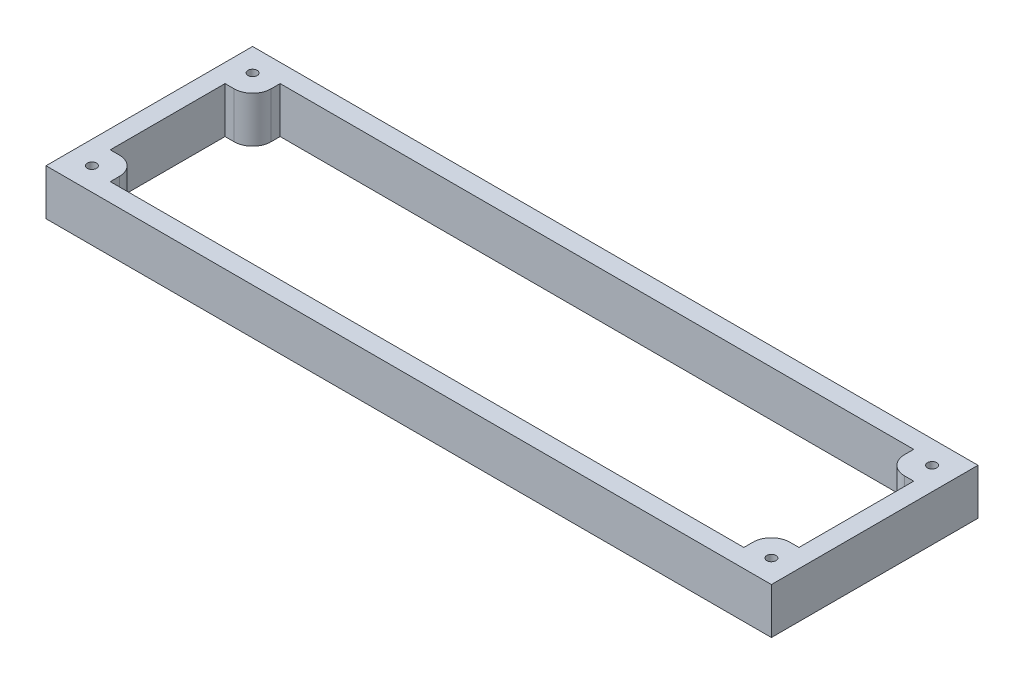
ISO-10303-21;
HEADER;
FILE_DESCRIPTION(('STEP AP214'),'2;1');
FILE_NAME('part.step','',(''),(''),'','','');
FILE_SCHEMA(('AUTOMOTIVE_DESIGN { 1 0 10303 214 1 1 1 1 }'));
ENDSEC;
DATA;
#1=APPLICATION_CONTEXT('core data for automotive mechanical design processes');
#2=APPLICATION_PROTOCOL_DEFINITION('international standard','automotive_design',2000,#1);
#3=PRODUCT_CONTEXT('',#1,'mechanical');
#4=PRODUCT('Part','Part','',(#3));
#5=PRODUCT_RELATED_PRODUCT_CATEGORY('part','',(#4));
#6=PRODUCT_DEFINITION_FORMATION('','',#4);
#7=PRODUCT_DEFINITION_CONTEXT('part definition',#1,'design');
#8=PRODUCT_DEFINITION('design','',#6,#7);
#9=PRODUCT_DEFINITION_SHAPE('','',#8);
#10=(LENGTH_UNIT() NAMED_UNIT(*) SI_UNIT(.MILLI.,.METRE.));
#11=(NAMED_UNIT(*) PLANE_ANGLE_UNIT() SI_UNIT($,.RADIAN.));
#12=(NAMED_UNIT(*) SI_UNIT($,.STERADIAN.) SOLID_ANGLE_UNIT());
#13=UNCERTAINTY_MEASURE_WITH_UNIT(LENGTH_MEASURE(1.E-05),#10,'distance_accuracy_value','');
#14=(GEOMETRIC_REPRESENTATION_CONTEXT(3) GLOBAL_UNCERTAINTY_ASSIGNED_CONTEXT((#13)) GLOBAL_UNIT_ASSIGNED_CONTEXT((#10,
#11,#12)) REPRESENTATION_CONTEXT('',''));
#15=CARTESIAN_POINT('',(0.,0.,0.));
#16=DIRECTION('',(0.,0.,1.));
#17=DIRECTION('',(1.,0.,0.));
#18=AXIS2_PLACEMENT_3D('',#15,#16,#17);
#19=CARTESIAN_POINT('',(0.,-8.,-11.25));
#20=DIRECTION('',(0.,0.,1.));
#21=DIRECTION('',(1.,0.,0.));
#22=AXIS2_PLACEMENT_3D('',#19,#20,#21);
#23=PLANE('',#22);
#24=DIRECTION('',(1.,0.,0.));
#25=VECTOR('',#24,1.);
#26=CARTESIAN_POINT('',(0.,-3.,-11.25));
#27=LINE('',#26,#25);
#28=CARTESIAN_POINT('',(-39.5,-3.,-11.25));
#29=VERTEX_POINT('',#28);
#30=CARTESIAN_POINT('',(39.5,-3.,-11.25));
#31=VERTEX_POINT('',#30);
#32=EDGE_CURVE('E295',#29,#31,#27,.T.);
#33=ORIENTED_EDGE('',*,*,#32,.T.);
#34=DIRECTION('',(0.,1.,0.));
#35=VECTOR('',#34,1.);
#36=CARTESIAN_POINT('',(39.5,-8.,-11.25));
#37=LINE('',#36,#35);
#38=CARTESIAN_POINT('',(39.5,-8.,-11.25));
#39=VERTEX_POINT('',#38);
#40=EDGE_CURVE('E11',#39,#31,#37,.T.);
#41=ORIENTED_EDGE('',*,*,#40,.F.);
#42=DIRECTION('',(1.,0.,0.));
#43=VECTOR('',#42,1.);
#44=CARTESIAN_POINT('',(0.,-8.,-11.25));
#45=LINE('',#44,#43);
#46=CARTESIAN_POINT('',(-39.5,-8.,-11.25));
#47=VERTEX_POINT('',#46);
#48=EDGE_CURVE('E201',#47,#39,#45,.T.);
#49=ORIENTED_EDGE('',*,*,#48,.F.);
#50=DIRECTION('',(0.,1.,0.));
#51=VECTOR('',#50,1.);
#52=CARTESIAN_POINT('',(-39.5,-8.,-11.25));
#53=LINE('',#52,#51);
#54=EDGE_CURVE('E318',#47,#29,#53,.T.);
#55=ORIENTED_EDGE('',*,*,#54,.T.);
#56=EDGE_LOOP('',(#33,#41,#49,#55));
#57=FACE_BOUND('',#56,.T.);
#58=ADVANCED_FACE('F45',(#57),#23,.F.);
#59=CARTESIAN_POINT('',(39.5,-8.,0.));
#60=DIRECTION('',(-1.,0.,0.));
#61=DIRECTION('',(0.,0.,1.));
#62=AXIS2_PLACEMENT_3D('',#59,#60,#61);
#63=PLANE('',#62);
#64=DIRECTION('',(0.,0.,1.));
#65=VECTOR('',#64,1.);
#66=CARTESIAN_POINT('',(39.5,-3.,0.));
#67=LINE('',#66,#65);
#68=CARTESIAN_POINT('',(39.5,-3.,11.25));
#69=VERTEX_POINT('',#68);
#70=EDGE_CURVE('E207',#31,#69,#67,.T.);
#71=ORIENTED_EDGE('',*,*,#70,.T.);
#72=DIRECTION('',(0.,1.,0.));
#73=VECTOR('',#72,1.);
#74=CARTESIAN_POINT('',(39.5,-8.,11.25));
#75=LINE('',#74,#73);
#76=CARTESIAN_POINT('',(39.5,-8.,11.25));
#77=VERTEX_POINT('',#76);
#78=EDGE_CURVE('E56',#77,#69,#75,.T.);
#79=ORIENTED_EDGE('',*,*,#78,.F.);
#80=DIRECTION('',(0.,0.,1.));
#81=VECTOR('',#80,1.);
#82=CARTESIAN_POINT('',(39.5,-8.,0.));
#83=LINE('',#82,#81);
#84=EDGE_CURVE('E194',#39,#77,#83,.T.);
#85=ORIENTED_EDGE('',*,*,#84,.F.);
#86=ORIENTED_EDGE('',*,*,#40,.T.);
#87=EDGE_LOOP('',(#71,#79,#85,#86));
#88=FACE_BOUND('',#87,.T.);
#89=ADVANCED_FACE('F206',(#88),#63,.F.);
#90=CARTESIAN_POINT('',(0.,-8.,11.25));
#91=DIRECTION('',(0.,0.,-1.));
#92=DIRECTION('',(-1.,0.,0.));
#93=AXIS2_PLACEMENT_3D('',#90,#91,#92);
#94=PLANE('',#93);
#95=DIRECTION('',(-1.,0.,0.));
#96=VECTOR('',#95,1.);
#97=CARTESIAN_POINT('',(0.,-3.,11.25));
#98=LINE('',#97,#96);
#99=CARTESIAN_POINT('',(-39.5,-3.,11.25));
#100=VERTEX_POINT('',#99);
#101=EDGE_CURVE('E130',#69,#100,#98,.T.);
#102=ORIENTED_EDGE('',*,*,#101,.T.);
#103=DIRECTION('',(0.,1.,0.));
#104=VECTOR('',#103,1.);
#105=CARTESIAN_POINT('',(-39.5,-8.,11.25));
#106=LINE('',#105,#104);
#107=CARTESIAN_POINT('',(-39.5,-8.,11.25));
#108=VERTEX_POINT('',#107);
#109=EDGE_CURVE('E209',#108,#100,#106,.T.);
#110=ORIENTED_EDGE('',*,*,#109,.F.);
#111=DIRECTION('',(-1.,0.,0.));
#112=VECTOR('',#111,1.);
#113=CARTESIAN_POINT('',(0.,-8.,11.25));
#114=LINE('',#113,#112);
#115=EDGE_CURVE('E199',#77,#108,#114,.T.);
#116=ORIENTED_EDGE('',*,*,#115,.F.);
#117=ORIENTED_EDGE('',*,*,#78,.T.);
#118=EDGE_LOOP('',(#102,#110,#116,#117));
#119=FACE_BOUND('',#118,.T.);
#120=ADVANCED_FACE('F211',(#119),#94,.F.);
#121=CARTESIAN_POINT('',(37.5,-8.,0.));
#122=DIRECTION('',(1.,0.,0.));
#123=DIRECTION('',(0.,0.,-1.));
#124=AXIS2_PLACEMENT_3D('',#121,#122,#123);
#125=PLANE('',#124);
#126=DIRECTION('',(0.,0.,-1.));
#127=VECTOR('',#126,1.);
#128=CARTESIAN_POINT('',(37.5,-3.,0.));
#129=LINE('',#128,#127);
#130=CARTESIAN_POINT('',(37.5,-3.,6.25));
#131=VERTEX_POINT('',#130);
#132=CARTESIAN_POINT('',(37.5,-3.,-6.25));
#133=VERTEX_POINT('',#132);
#134=EDGE_CURVE('E231',#131,#133,#129,.T.);
#135=ORIENTED_EDGE('',*,*,#134,.T.);
#136=DIRECTION('',(0.,1.,0.));
#137=VECTOR('',#136,1.);
#138=CARTESIAN_POINT('',(37.5,-8.,-6.25));
#139=LINE('',#138,#137);
#140=CARTESIAN_POINT('',(37.5,-8.,-6.25));
#141=VERTEX_POINT('',#140);
#142=EDGE_CURVE('E49',#141,#133,#139,.T.);
#143=ORIENTED_EDGE('',*,*,#142,.F.);
#144=DIRECTION('',(0.,0.,-1.));
#145=VECTOR('',#144,1.);
#146=CARTESIAN_POINT('',(37.5,-8.,0.));
#147=LINE('',#146,#145);
#148=CARTESIAN_POINT('',(37.5,-8.,6.25));
#149=VERTEX_POINT('',#148);
#150=EDGE_CURVE('E317',#149,#141,#147,.T.);
#151=ORIENTED_EDGE('',*,*,#150,.F.);
#152=DIRECTION('',(0.,1.,0.));
#153=VECTOR('',#152,1.);
#154=CARTESIAN_POINT('',(37.5,-8.,6.25));
#155=LINE('',#154,#153);
#156=EDGE_CURVE('E230',#149,#131,#155,.T.);
#157=ORIENTED_EDGE('',*,*,#156,.T.);
#158=EDGE_LOOP('',(#135,#143,#151,#157));
#159=FACE_BOUND('',#158,.T.);
#160=ADVANCED_FACE('F47',(#159),#125,.F.);
#161=CARTESIAN_POINT('',(0.,-8.,-6.25000000000001));
#162=DIRECTION('',(0.,0.,-1.));
#163=DIRECTION('',(-1.,0.,0.));
#164=AXIS2_PLACEMENT_3D('',#161,#162,#163);
#165=PLANE('',#164);
#166=DIRECTION('',(-1.,0.,0.));
#167=VECTOR('',#166,1.);
#168=CARTESIAN_POINT('',(0.,-3.,-6.25000000000001));
#169=LINE('',#168,#167);
#170=CARTESIAN_POINT('',(36.5,-3.,-6.25));
#171=VERTEX_POINT('',#170);
#172=EDGE_CURVE('E235',#133,#171,#169,.T.);
#173=ORIENTED_EDGE('',*,*,#172,.T.);
#174=DIRECTION('',(0.,1.,0.));
#175=VECTOR('',#174,1.);
#176=CARTESIAN_POINT('',(36.5,-8.,-6.25));
#177=LINE('',#176,#175);
#178=CARTESIAN_POINT('',(36.5,-8.,-6.25));
#179=VERTEX_POINT('',#178);
#180=EDGE_CURVE('E366',#179,#171,#177,.T.);
#181=ORIENTED_EDGE('',*,*,#180,.F.);
#182=DIRECTION('',(-1.,0.,0.));
#183=VECTOR('',#182,1.);
#184=CARTESIAN_POINT('',(0.,-8.,-6.25000000000001));
#185=LINE('',#184,#183);
#186=EDGE_CURVE('E145',#141,#179,#185,.T.);
#187=ORIENTED_EDGE('',*,*,#186,.F.);
#188=ORIENTED_EDGE('',*,*,#142,.T.);
#189=EDGE_LOOP('',(#173,#181,#187,#188));
#190=FACE_BOUND('',#189,.T.);
#191=ADVANCED_FACE('F374',(#190),#165,.F.);
#192=CARTESIAN_POINT('',(36.5,-8.,-8.25));
#193=DIRECTION('',(0.,1.,0.));
#194=DIRECTION('',(0.,0.,1.));
#195=AXIS2_PLACEMENT_3D('',#192,#193,#194);
#196=CYLINDRICAL_SURFACE('',#195,2.);
#197=CARTESIAN_POINT('',(36.5,-3.,-8.25));
#198=DIRECTION('',(0.,-1.,0.));
#199=DIRECTION('',(0.,0.,-1.));
#200=AXIS2_PLACEMENT_3D('',#197,#198,#199);
#201=CIRCLE('',#200,2.);
#202=CARTESIAN_POINT('',(34.5,-3.,-8.25000000000002));
#203=VERTEX_POINT('',#202);
#204=EDGE_CURVE('E238',#171,#203,#201,.T.);
#205=ORIENTED_EDGE('',*,*,#204,.T.);
#206=DIRECTION('',(0.,1.,0.));
#207=VECTOR('',#206,1.);
#208=CARTESIAN_POINT('',(34.5,-8.,-8.25000000000002));
#209=LINE('',#208,#207);
#210=CARTESIAN_POINT('',(34.5,-8.,-8.25000000000002));
#211=VERTEX_POINT('',#210);
#212=EDGE_CURVE('E364',#211,#203,#209,.T.);
#213=ORIENTED_EDGE('',*,*,#212,.F.);
#214=CARTESIAN_POINT('',(36.5,-8.,-8.25));
#215=DIRECTION('',(0.,-1.,0.));
#216=DIRECTION('',(0.,0.,-1.));
#217=AXIS2_PLACEMENT_3D('',#214,#215,#216);
#218=CIRCLE('',#217,2.);
#219=EDGE_CURVE('E459',#179,#211,#218,.T.);
#220=ORIENTED_EDGE('',*,*,#219,.F.);
#221=ORIENTED_EDGE('',*,*,#180,.T.);
#222=EDGE_LOOP('',(#205,#213,#220,#221));
#223=FACE_BOUND('',#222,.T.);
#224=ADVANCED_FACE('F458',(#223),#196,.T.);
#225=CARTESIAN_POINT('',(34.5,-8.,0.));
#226=DIRECTION('',(-1.,0.,0.));
#227=DIRECTION('',(0.,0.,1.));
#228=AXIS2_PLACEMENT_3D('',#225,#226,#227);
#229=PLANE('',#228);
#230=DIRECTION('',(0.,0.,1.));
#231=VECTOR('',#230,1.);
#232=CARTESIAN_POINT('',(34.5,-3.,0.));
#233=LINE('',#232,#231);
#234=CARTESIAN_POINT('',(34.5,-3.,-9.25));
#235=VERTEX_POINT('',#234);
#236=EDGE_CURVE('E242',#235,#203,#233,.T.);
#237=ORIENTED_EDGE('',*,*,#236,.F.);
#238=DIRECTION('',(0.,1.,0.));
#239=VECTOR('',#238,1.);
#240=CARTESIAN_POINT('',(34.5,-8.,-9.25));
#241=LINE('',#240,#239);
#242=CARTESIAN_POINT('',(34.5,-8.,-9.25));
#243=VERTEX_POINT('',#242);
#244=EDGE_CURVE('E361',#243,#235,#241,.T.);
#245=ORIENTED_EDGE('',*,*,#244,.F.);
#246=DIRECTION('',(0.,0.,1.));
#247=VECTOR('',#246,1.);
#248=CARTESIAN_POINT('',(34.5,-8.,0.));
#249=LINE('',#248,#247);
#250=EDGE_CURVE('E460',#243,#211,#249,.T.);
#251=ORIENTED_EDGE('',*,*,#250,.T.);
#252=ORIENTED_EDGE('',*,*,#212,.T.);
#253=EDGE_LOOP('',(#237,#245,#251,#252));
#254=FACE_BOUND('',#253,.T.);
#255=ADVANCED_FACE('F456',(#254),#229,.T.);
#256=CARTESIAN_POINT('',(0.,-8.,-9.25));
#257=DIRECTION('',(0.,0.,1.));
#258=DIRECTION('',(1.,0.,0.));
#259=AXIS2_PLACEMENT_3D('',#256,#257,#258);
#260=PLANE('',#259);
#261=DIRECTION('',(1.,0.,0.));
#262=VECTOR('',#261,1.);
#263=CARTESIAN_POINT('',(0.,-3.,-9.25));
#264=LINE('',#263,#262);
#265=CARTESIAN_POINT('',(-34.5,-3.,-9.25));
#266=VERTEX_POINT('',#265);
#267=EDGE_CURVE('E246',#266,#235,#264,.T.);
#268=ORIENTED_EDGE('',*,*,#267,.F.);
#269=DIRECTION('',(0.,1.,0.));
#270=VECTOR('',#269,1.);
#271=CARTESIAN_POINT('',(-34.5,-8.,-9.25));
#272=LINE('',#271,#270);
#273=CARTESIAN_POINT('',(-34.5,-8.,-9.25));
#274=VERTEX_POINT('',#273);
#275=EDGE_CURVE('E358',#274,#266,#272,.T.);
#276=ORIENTED_EDGE('',*,*,#275,.F.);
#277=DIRECTION('',(1.,0.,0.));
#278=VECTOR('',#277,1.);
#279=CARTESIAN_POINT('',(0.,-8.,-9.25));
#280=LINE('',#279,#278);
#281=EDGE_CURVE('E452',#274,#243,#280,.T.);
#282=ORIENTED_EDGE('',*,*,#281,.T.);
#283=ORIENTED_EDGE('',*,*,#244,.T.);
#284=EDGE_LOOP('',(#268,#276,#282,#283));
#285=FACE_BOUND('',#284,.T.);
#286=ADVANCED_FACE('F449',(#285),#260,.T.);
#287=CARTESIAN_POINT('',(-34.5,-8.,0.));
#288=DIRECTION('',(-1.,0.,0.));
#289=DIRECTION('',(0.,0.,1.));
#290=AXIS2_PLACEMENT_3D('',#287,#288,#289);
#291=PLANE('',#290);
#292=DIRECTION('',(0.,0.,1.));
#293=VECTOR('',#292,1.);
#294=CARTESIAN_POINT('',(-34.5,-3.,0.));
#295=LINE('',#294,#293);
#296=CARTESIAN_POINT('',(-34.5,-3.,-8.25000000000002));
#297=VERTEX_POINT('',#296);
#298=EDGE_CURVE('E250',#266,#297,#295,.T.);
#299=ORIENTED_EDGE('',*,*,#298,.T.);
#300=DIRECTION('',(0.,1.,0.));
#301=VECTOR('',#300,1.);
#302=CARTESIAN_POINT('',(-34.5,-8.,-8.25000000000002));
#303=LINE('',#302,#301);
#304=CARTESIAN_POINT('',(-34.5,-8.,-8.25000000000002));
#305=VERTEX_POINT('',#304);
#306=EDGE_CURVE('E354',#305,#297,#303,.T.);
#307=ORIENTED_EDGE('',*,*,#306,.F.);
#308=DIRECTION('',(0.,0.,1.));
#309=VECTOR('',#308,1.);
#310=CARTESIAN_POINT('',(-34.5,-8.,0.));
#311=LINE('',#310,#309);
#312=EDGE_CURVE('E445',#274,#305,#311,.T.);
#313=ORIENTED_EDGE('',*,*,#312,.F.);
#314=ORIENTED_EDGE('',*,*,#275,.T.);
#315=EDGE_LOOP('',(#299,#307,#313,#314));
#316=FACE_BOUND('',#315,.T.);
#317=ADVANCED_FACE('F444',(#316),#291,.F.);
#318=CARTESIAN_POINT('',(-36.5,-8.,-8.25000000000001));
#319=DIRECTION('',(0.,1.,0.));
#320=DIRECTION('',(0.,0.,1.));
#321=AXIS2_PLACEMENT_3D('',#318,#319,#320);
#322=CYLINDRICAL_SURFACE('',#321,2.);
#323=CARTESIAN_POINT('',(-36.5,-3.,-8.25000000000001));
#324=DIRECTION('',(0.,-1.,0.));
#325=DIRECTION('',(0.,0.,-1.));
#326=AXIS2_PLACEMENT_3D('',#323,#324,#325);
#327=CIRCLE('',#326,2.);
#328=CARTESIAN_POINT('',(-36.5,-3.,-6.25000000000001));
#329=VERTEX_POINT('',#328);
#330=EDGE_CURVE('E253',#297,#329,#327,.T.);
#331=ORIENTED_EDGE('',*,*,#330,.T.);
#332=DIRECTION('',(0.,1.,0.));
#333=VECTOR('',#332,1.);
#334=CARTESIAN_POINT('',(-36.5,-8.,-6.25000000000001));
#335=LINE('',#334,#333);
#336=CARTESIAN_POINT('',(-36.5,-8.,-6.25000000000001));
#337=VERTEX_POINT('',#336);
#338=EDGE_CURVE('E351',#337,#329,#335,.T.);
#339=ORIENTED_EDGE('',*,*,#338,.F.);
#340=CARTESIAN_POINT('',(-36.5,-8.,-8.25000000000001));
#341=DIRECTION('',(0.,-1.,0.));
#342=DIRECTION('',(0.,0.,-1.));
#343=AXIS2_PLACEMENT_3D('',#340,#341,#342);
#344=CIRCLE('',#343,2.);
#345=EDGE_CURVE('E441',#305,#337,#344,.T.);
#346=ORIENTED_EDGE('',*,*,#345,.F.);
#347=ORIENTED_EDGE('',*,*,#306,.T.);
#348=EDGE_LOOP('',(#331,#339,#346,#347));
#349=FACE_BOUND('',#348,.T.);
#350=ADVANCED_FACE('F439',(#349),#322,.T.);
#351=CARTESIAN_POINT('',(0.,-8.,-6.25000000000001));
#352=DIRECTION('',(0.,0.,1.));
#353=DIRECTION('',(1.,0.,0.));
#354=AXIS2_PLACEMENT_3D('',#351,#352,#353);
#355=PLANE('',#354);
#356=DIRECTION('',(1.,0.,0.));
#357=VECTOR('',#356,1.);
#358=CARTESIAN_POINT('',(0.,-3.,-6.25000000000001));
#359=LINE('',#358,#357);
#360=CARTESIAN_POINT('',(-37.5,-3.,-6.25000000000001));
#361=VERTEX_POINT('',#360);
#362=EDGE_CURVE('E257',#361,#329,#359,.T.);
#363=ORIENTED_EDGE('',*,*,#362,.F.);
#364=DIRECTION('',(0.,1.,0.));
#365=VECTOR('',#364,1.);
#366=CARTESIAN_POINT('',(-37.5,-8.,-6.25000000000001));
#367=LINE('',#366,#365);
#368=CARTESIAN_POINT('',(-37.5,-8.,-6.25000000000001));
#369=VERTEX_POINT('',#368);
#370=EDGE_CURVE('E348',#369,#361,#367,.T.);
#371=ORIENTED_EDGE('',*,*,#370,.F.);
#372=DIRECTION('',(1.,0.,0.));
#373=VECTOR('',#372,1.);
#374=CARTESIAN_POINT('',(0.,-8.,-6.25000000000001));
#375=LINE('',#374,#373);
#376=EDGE_CURVE('E436',#369,#337,#375,.T.);
#377=ORIENTED_EDGE('',*,*,#376,.T.);
#378=ORIENTED_EDGE('',*,*,#338,.T.);
#379=EDGE_LOOP('',(#363,#371,#377,#378));
#380=FACE_BOUND('',#379,.T.);
#381=ADVANCED_FACE('F432',(#380),#355,.T.);
#382=CARTESIAN_POINT('',(-37.5,-8.,0.));
#383=DIRECTION('',(1.,0.,0.));
#384=DIRECTION('',(0.,0.,-1.));
#385=AXIS2_PLACEMENT_3D('',#382,#383,#384);
#386=PLANE('',#385);
#387=DIRECTION('',(0.,0.,-1.));
#388=VECTOR('',#387,1.);
#389=CARTESIAN_POINT('',(-37.5,-3.,0.));
#390=LINE('',#389,#388);
#391=CARTESIAN_POINT('',(-37.5,-3.,6.25));
#392=VERTEX_POINT('',#391);
#393=EDGE_CURVE('E261',#392,#361,#390,.T.);
#394=ORIENTED_EDGE('',*,*,#393,.F.);
#395=DIRECTION('',(0.,1.,0.));
#396=VECTOR('',#395,1.);
#397=CARTESIAN_POINT('',(-37.5,-8.,6.25));
#398=LINE('',#397,#396);
#399=CARTESIAN_POINT('',(-37.5,-8.,6.25));
#400=VERTEX_POINT('',#399);
#401=EDGE_CURVE('E345',#400,#392,#398,.T.);
#402=ORIENTED_EDGE('',*,*,#401,.F.);
#403=DIRECTION('',(0.,0.,-1.));
#404=VECTOR('',#403,1.);
#405=CARTESIAN_POINT('',(-37.5,-8.,0.));
#406=LINE('',#405,#404);
#407=EDGE_CURVE('E427',#400,#369,#406,.T.);
#408=ORIENTED_EDGE('',*,*,#407,.T.);
#409=ORIENTED_EDGE('',*,*,#370,.T.);
#410=EDGE_LOOP('',(#394,#402,#408,#409));
#411=FACE_BOUND('',#410,.T.);
#412=ADVANCED_FACE('F426',(#411),#386,.T.);
#413=CARTESIAN_POINT('',(0.,-8.,6.25));
#414=DIRECTION('',(0.,0.,1.));
#415=DIRECTION('',(1.,0.,0.));
#416=AXIS2_PLACEMENT_3D('',#413,#414,#415);
#417=PLANE('',#416);
#418=DIRECTION('',(1.,0.,0.));
#419=VECTOR('',#418,1.);
#420=CARTESIAN_POINT('',(0.,-3.,6.25));
#421=LINE('',#420,#419);
#422=CARTESIAN_POINT('',(-36.5,-3.,6.25));
#423=VERTEX_POINT('',#422);
#424=EDGE_CURVE('E265',#392,#423,#421,.T.);
#425=ORIENTED_EDGE('',*,*,#424,.T.);
#426=DIRECTION('',(0.,1.,0.));
#427=VECTOR('',#426,1.);
#428=CARTESIAN_POINT('',(-36.5,-8.,6.25));
#429=LINE('',#428,#427);
#430=CARTESIAN_POINT('',(-36.5,-8.,6.25));
#431=VERTEX_POINT('',#430);
#432=EDGE_CURVE('E342',#431,#423,#429,.T.);
#433=ORIENTED_EDGE('',*,*,#432,.F.);
#434=DIRECTION('',(1.,0.,0.));
#435=VECTOR('',#434,1.);
#436=CARTESIAN_POINT('',(0.,-8.,6.25));
#437=LINE('',#436,#435);
#438=EDGE_CURVE('E422',#400,#431,#437,.T.);
#439=ORIENTED_EDGE('',*,*,#438,.F.);
#440=ORIENTED_EDGE('',*,*,#401,.T.);
#441=EDGE_LOOP('',(#425,#433,#439,#440));
#442=FACE_BOUND('',#441,.T.);
#443=ADVANCED_FACE('F421',(#442),#417,.F.);
#444=CARTESIAN_POINT('',(-36.5,-8.,8.25));
#445=DIRECTION('',(0.,1.,0.));
#446=DIRECTION('',(0.,0.,1.));
#447=AXIS2_PLACEMENT_3D('',#444,#445,#446);
#448=CYLINDRICAL_SURFACE('',#447,2.);
#449=CARTESIAN_POINT('',(-36.5,-3.,8.25));
#450=DIRECTION('',(0.,-1.,0.));
#451=DIRECTION('',(0.,0.,-1.));
#452=AXIS2_PLACEMENT_3D('',#449,#450,#451);
#453=CIRCLE('',#452,2.);
#454=CARTESIAN_POINT('',(-34.5,-3.,8.25000000000002));
#455=VERTEX_POINT('',#454);
#456=EDGE_CURVE('E269',#455,#423,#453,.F.);
#457=ORIENTED_EDGE('',*,*,#456,.F.);
#458=DIRECTION('',(0.,1.,0.));
#459=VECTOR('',#458,1.);
#460=CARTESIAN_POINT('',(-34.5,-8.,8.25000000000002));
#461=LINE('',#460,#459);
#462=CARTESIAN_POINT('',(-34.5,-8.,8.25000000000002));
#463=VERTEX_POINT('',#462);
#464=EDGE_CURVE('E339',#463,#455,#461,.T.);
#465=ORIENTED_EDGE('',*,*,#464,.F.);
#466=CARTESIAN_POINT('',(-36.5,-8.,8.25));
#467=DIRECTION('',(0.,-1.,0.));
#468=DIRECTION('',(0.,0.,-1.));
#469=AXIS2_PLACEMENT_3D('',#466,#467,#468);
#470=CIRCLE('',#469,2.);
#471=EDGE_CURVE('E418',#463,#431,#470,.F.);
#472=ORIENTED_EDGE('',*,*,#471,.T.);
#473=ORIENTED_EDGE('',*,*,#432,.T.);
#474=EDGE_LOOP('',(#457,#465,#472,#473));
#475=FACE_BOUND('',#474,.T.);
#476=ADVANCED_FACE('F414',(#475),#448,.T.);
#477=CARTESIAN_POINT('',(-34.5,-8.,0.));
#478=DIRECTION('',(1.,0.,0.));
#479=DIRECTION('',(0.,0.,-1.));
#480=AXIS2_PLACEMENT_3D('',#477,#478,#479);
#481=PLANE('',#480);
#482=DIRECTION('',(0.,0.,-1.));
#483=VECTOR('',#482,1.);
#484=CARTESIAN_POINT('',(-34.5,-3.,0.));
#485=LINE('',#484,#483);
#486=CARTESIAN_POINT('',(-34.5,-3.,9.25));
#487=VERTEX_POINT('',#486);
#488=EDGE_CURVE('E273',#487,#455,#485,.T.);
#489=ORIENTED_EDGE('',*,*,#488,.F.);
#490=DIRECTION('',(0.,1.,0.));
#491=VECTOR('',#490,1.);
#492=CARTESIAN_POINT('',(-34.5,-8.,9.25));
#493=LINE('',#492,#491);
#494=CARTESIAN_POINT('',(-34.5,-8.,9.25));
#495=VERTEX_POINT('',#494);
#496=EDGE_CURVE('E336',#495,#487,#493,.T.);
#497=ORIENTED_EDGE('',*,*,#496,.F.);
#498=DIRECTION('',(0.,0.,-1.));
#499=VECTOR('',#498,1.);
#500=CARTESIAN_POINT('',(-34.5,-8.,0.));
#501=LINE('',#500,#499);
#502=EDGE_CURVE('E409',#495,#463,#501,.T.);
#503=ORIENTED_EDGE('',*,*,#502,.T.);
#504=ORIENTED_EDGE('',*,*,#464,.T.);
#505=EDGE_LOOP('',(#489,#497,#503,#504));
#506=FACE_BOUND('',#505,.T.);
#507=ADVANCED_FACE('F408',(#506),#481,.T.);
#508=CARTESIAN_POINT('',(0.,-8.,9.25));
#509=DIRECTION('',(0.,0.,1.));
#510=DIRECTION('',(1.,0.,0.));
#511=AXIS2_PLACEMENT_3D('',#508,#509,#510);
#512=PLANE('',#511);
#513=DIRECTION('',(1.,0.,0.));
#514=VECTOR('',#513,1.);
#515=CARTESIAN_POINT('',(0.,-3.,9.25));
#516=LINE('',#515,#514);
#517=CARTESIAN_POINT('',(34.5,-3.,9.25));
#518=VERTEX_POINT('',#517);
#519=EDGE_CURVE('E277',#487,#518,#516,.T.);
#520=ORIENTED_EDGE('',*,*,#519,.T.);
#521=DIRECTION('',(0.,1.,0.));
#522=VECTOR('',#521,1.);
#523=CARTESIAN_POINT('',(34.5,-8.,9.25));
#524=LINE('',#523,#522);
#525=CARTESIAN_POINT('',(34.5,-8.,9.25));
#526=VERTEX_POINT('',#525);
#527=EDGE_CURVE('E332',#526,#518,#524,.T.);
#528=ORIENTED_EDGE('',*,*,#527,.F.);
#529=DIRECTION('',(1.,0.,0.));
#530=VECTOR('',#529,1.);
#531=CARTESIAN_POINT('',(0.,-8.,9.25));
#532=LINE('',#531,#530);
#533=EDGE_CURVE('E404',#495,#526,#532,.T.);
#534=ORIENTED_EDGE('',*,*,#533,.F.);
#535=ORIENTED_EDGE('',*,*,#496,.T.);
#536=EDGE_LOOP('',(#520,#528,#534,#535));
#537=FACE_BOUND('',#536,.T.);
#538=ADVANCED_FACE('F403',(#537),#512,.F.);
#539=CARTESIAN_POINT('',(34.5,-8.,0.));
#540=DIRECTION('',(1.,0.,0.));
#541=DIRECTION('',(0.,0.,-1.));
#542=AXIS2_PLACEMENT_3D('',#539,#540,#541);
#543=PLANE('',#542);
#544=DIRECTION('',(0.,0.,-1.));
#545=VECTOR('',#544,1.);
#546=CARTESIAN_POINT('',(34.5,-3.,0.));
#547=LINE('',#546,#545);
#548=CARTESIAN_POINT('',(34.5,-3.,8.25000000000002));
#549=VERTEX_POINT('',#548);
#550=EDGE_CURVE('E280',#518,#549,#547,.T.);
#551=ORIENTED_EDGE('',*,*,#550,.T.);
#552=DIRECTION('',(0.,1.,0.));
#553=VECTOR('',#552,1.);
#554=CARTESIAN_POINT('',(34.5,-8.,8.25000000000002));
#555=LINE('',#554,#553);
#556=CARTESIAN_POINT('',(34.5,-8.,8.25000000000002));
#557=VERTEX_POINT('',#556);
#558=EDGE_CURVE('E328',#557,#549,#555,.T.);
#559=ORIENTED_EDGE('',*,*,#558,.F.);
#560=DIRECTION('',(0.,0.,-1.));
#561=VECTOR('',#560,1.);
#562=CARTESIAN_POINT('',(34.5,-8.,0.));
#563=LINE('',#562,#561);
#564=EDGE_CURVE('E400',#526,#557,#563,.T.);
#565=ORIENTED_EDGE('',*,*,#564,.F.);
#566=ORIENTED_EDGE('',*,*,#527,.T.);
#567=EDGE_LOOP('',(#551,#559,#565,#566));
#568=FACE_BOUND('',#567,.T.);
#569=ADVANCED_FACE('F397',(#568),#543,.F.);
#570=CARTESIAN_POINT('',(36.5,-8.,8.25));
#571=DIRECTION('',(0.,1.,0.));
#572=DIRECTION('',(0.,0.,1.));
#573=AXIS2_PLACEMENT_3D('',#570,#571,#572);
#574=CYLINDRICAL_SURFACE('',#573,2.);
#575=CARTESIAN_POINT('',(36.5,-3.,8.25));
#576=DIRECTION('',(0.,-1.,0.));
#577=DIRECTION('',(0.,0.,-1.));
#578=AXIS2_PLACEMENT_3D('',#575,#576,#577);
#579=CIRCLE('',#578,2.);
#580=CARTESIAN_POINT('',(36.5,-3.,6.25));
#581=VERTEX_POINT('',#580);
#582=EDGE_CURVE('E283',#549,#581,#579,.T.);
#583=ORIENTED_EDGE('',*,*,#582,.T.);
#584=DIRECTION('',(0.,1.,0.));
#585=VECTOR('',#584,1.);
#586=CARTESIAN_POINT('',(36.5,-8.,6.25));
#587=LINE('',#586,#585);
#588=CARTESIAN_POINT('',(36.5,-8.,6.25));
#589=VERTEX_POINT('',#588);
#590=EDGE_CURVE('E325',#589,#581,#587,.T.);
#591=ORIENTED_EDGE('',*,*,#590,.F.);
#592=CARTESIAN_POINT('',(36.5,-8.,8.25));
#593=DIRECTION('',(0.,-1.,0.));
#594=DIRECTION('',(0.,0.,-1.));
#595=AXIS2_PLACEMENT_3D('',#592,#593,#594);
#596=CIRCLE('',#595,2.);
#597=EDGE_CURVE('E488',#557,#589,#596,.T.);
#598=ORIENTED_EDGE('',*,*,#597,.F.);
#599=ORIENTED_EDGE('',*,*,#558,.T.);
#600=EDGE_LOOP('',(#583,#591,#598,#599));
#601=FACE_BOUND('',#600,.T.);
#602=ADVANCED_FACE('F391',(#601),#574,.T.);
#603=CARTESIAN_POINT('',(37.,-8.,8.75));
#604=DIRECTION('',(0.,1.,0.));
#605=DIRECTION('',(0.,0.,1.));
#606=AXIS2_PLACEMENT_3D('',#603,#604,#605);
#607=CYLINDRICAL_SURFACE('',#606,0.499999999999999);
#608=CARTESIAN_POINT('',(37.,-8.,8.75));
#609=DIRECTION('',(0.,-1.,0.));
#610=DIRECTION('',(0.,0.,-1.));
#611=AXIS2_PLACEMENT_3D('',#608,#609,#610);
#612=CIRCLE('',#611,0.499999999999999);
#613=CARTESIAN_POINT('',(37.,-8.,8.25));
#614=VERTEX_POINT('',#613);
#615=EDGE_CURVE('E222',#614,#614,#612,.T.);
#616=ORIENTED_EDGE('',*,*,#615,.T.);
#617=EDGE_LOOP('',(#616));
#618=FACE_BOUND('',#617,.T.);
#619=CARTESIAN_POINT('',(37.,-3.,8.75));
#620=DIRECTION('',(0.,-1.,0.));
#621=DIRECTION('',(0.,0.,-1.));
#622=AXIS2_PLACEMENT_3D('',#619,#620,#621);
#623=CIRCLE('',#622,0.499999999999999);
#624=CARTESIAN_POINT('',(37.,-3.,8.25));
#625=VERTEX_POINT('',#624);
#626=EDGE_CURVE('E309',#625,#625,#623,.T.);
#627=ORIENTED_EDGE('',*,*,#626,.F.);
#628=EDGE_LOOP('',(#627));
#629=FACE_BOUND('',#628,.T.);
#630=ADVANCED_FACE('F528',(#618,#629),#607,.F.);
#631=CARTESIAN_POINT('',(-37.,-8.,-8.75000000000001));
#632=DIRECTION('',(0.,1.,0.));
#633=DIRECTION('',(0.,0.,1.));
#634=AXIS2_PLACEMENT_3D('',#631,#632,#633);
#635=CYLINDRICAL_SURFACE('',#634,0.499999999999999);
#636=CARTESIAN_POINT('',(-37.,-8.,-8.75000000000001));
#637=DIRECTION('',(0.,-1.,0.));
#638=DIRECTION('',(0.,0.,-1.));
#639=AXIS2_PLACEMENT_3D('',#636,#637,#638);
#640=CIRCLE('',#639,0.499999999999999);
#641=CARTESIAN_POINT('',(-37.,-8.,-9.25000000000001));
#642=VERTEX_POINT('',#641);
#643=EDGE_CURVE('E215',#642,#642,#640,.T.);
#644=ORIENTED_EDGE('',*,*,#643,.T.);
#645=EDGE_LOOP('',(#644));
#646=FACE_BOUND('',#645,.T.);
#647=CARTESIAN_POINT('',(-37.,-3.,-8.75000000000001));
#648=DIRECTION('',(0.,-1.,0.));
#649=DIRECTION('',(0.,0.,-1.));
#650=AXIS2_PLACEMENT_3D('',#647,#648,#649);
#651=CIRCLE('',#650,0.499999999999999);
#652=CARTESIAN_POINT('',(-37.,-3.,-9.25000000000001));
#653=VERTEX_POINT('',#652);
#654=EDGE_CURVE('E305',#653,#653,#651,.T.);
#655=ORIENTED_EDGE('',*,*,#654,.F.);
#656=EDGE_LOOP('',(#655));
#657=FACE_BOUND('',#656,.T.);
#658=ADVANCED_FACE('F564',(#646,#657),#635,.F.);
#659=CARTESIAN_POINT('',(-39.5,-8.,0.));
#660=DIRECTION('',(1.,0.,0.));
#661=DIRECTION('',(0.,0.,-1.));
#662=AXIS2_PLACEMENT_3D('',#659,#660,#661);
#663=PLANE('',#662);
#664=DIRECTION('',(0.,0.,-1.));
#665=VECTOR('',#664,1.);
#666=CARTESIAN_POINT('',(-39.5,-3.,0.));
#667=LINE('',#666,#665);
#668=EDGE_CURVE('E136',#100,#29,#667,.T.);
#669=ORIENTED_EDGE('',*,*,#668,.T.);
#670=ORIENTED_EDGE('',*,*,#54,.F.);
#671=DIRECTION('',(0.,0.,-1.));
#672=VECTOR('',#671,1.);
#673=CARTESIAN_POINT('',(-39.5,-8.,0.));
#674=LINE('',#673,#672);
#675=EDGE_CURVE('E65',#108,#47,#674,.T.);
#676=ORIENTED_EDGE('',*,*,#675,.F.);
#677=ORIENTED_EDGE('',*,*,#109,.T.);
#678=EDGE_LOOP('',(#669,#670,#676,#677));
#679=FACE_BOUND('',#678,.T.);
#680=ADVANCED_FACE('F523',(#679),#663,.F.);
#681=CARTESIAN_POINT('',(-37.,-8.,8.75));
#682=DIRECTION('',(0.,1.,0.));
#683=DIRECTION('',(0.,0.,1.));
#684=AXIS2_PLACEMENT_3D('',#681,#682,#683);
#685=CYLINDRICAL_SURFACE('',#684,0.499999999999999);
#686=CARTESIAN_POINT('',(-37.,-8.,8.75));
#687=DIRECTION('',(0.,-1.,0.));
#688=DIRECTION('',(0.,0.,-1.));
#689=AXIS2_PLACEMENT_3D('',#686,#687,#688);
#690=CIRCLE('',#689,0.499999999999999);
#691=CARTESIAN_POINT('',(-37.,-8.,8.25));
#692=VERTEX_POINT('',#691);
#693=EDGE_CURVE('E493',#692,#692,#690,.T.);
#694=ORIENTED_EDGE('',*,*,#693,.T.);
#695=EDGE_LOOP('',(#694));
#696=FACE_BOUND('',#695,.T.);
#697=CARTESIAN_POINT('',(-37.,-3.,8.75));
#698=DIRECTION('',(0.,-1.,0.));
#699=DIRECTION('',(0.,0.,-1.));
#700=AXIS2_PLACEMENT_3D('',#697,#698,#699);
#701=CIRCLE('',#700,0.499999999999999);
#702=CARTESIAN_POINT('',(-37.,-3.,8.25));
#703=VERTEX_POINT('',#702);
#704=EDGE_CURVE('E291',#703,#703,#701,.T.);
#705=ORIENTED_EDGE('',*,*,#704,.F.);
#706=EDGE_LOOP('',(#705));
#707=FACE_BOUND('',#706,.T.);
#708=ADVANCED_FACE('F499',(#696,#707),#685,.F.);
#709=CARTESIAN_POINT('',(0.,-8.,6.25));
#710=DIRECTION('',(0.,0.,-1.));
#711=DIRECTION('',(-1.,0.,0.));
#712=AXIS2_PLACEMENT_3D('',#709,#710,#711);
#713=PLANE('',#712);
#714=DIRECTION('',(-1.,0.,0.));
#715=VECTOR('',#714,1.);
#716=CARTESIAN_POINT('',(0.,-3.,6.25));
#717=LINE('',#716,#715);
#718=EDGE_CURVE('E287',#131,#581,#717,.T.);
#719=ORIENTED_EDGE('',*,*,#718,.F.);
#720=ORIENTED_EDGE('',*,*,#156,.F.);
#721=DIRECTION('',(-1.,0.,0.));
#722=VECTOR('',#721,1.);
#723=CARTESIAN_POINT('',(0.,-8.,6.25));
#724=LINE('',#723,#722);
#725=EDGE_CURVE('E388',#149,#589,#724,.T.);
#726=ORIENTED_EDGE('',*,*,#725,.T.);
#727=ORIENTED_EDGE('',*,*,#590,.T.);
#728=EDGE_LOOP('',(#719,#720,#726,#727));
#729=FACE_BOUND('',#728,.T.);
#730=ADVANCED_FACE('F384',(#729),#713,.T.);
#731=CARTESIAN_POINT('',(37.,-8.,-8.75));
#732=DIRECTION('',(0.,1.,0.));
#733=DIRECTION('',(0.,0.,1.));
#734=AXIS2_PLACEMENT_3D('',#731,#732,#733);
#735=CYLINDRICAL_SURFACE('',#734,0.499999999999999);
#736=CARTESIAN_POINT('',(37.,-8.,-8.75));
#737=DIRECTION('',(0.,-1.,0.));
#738=DIRECTION('',(0.,0.,-1.));
#739=AXIS2_PLACEMENT_3D('',#736,#737,#738);
#740=CIRCLE('',#739,0.499999999999999);
#741=CARTESIAN_POINT('',(37.,-8.,-9.25));
#742=VERTEX_POINT('',#741);
#743=EDGE_CURVE('E226',#742,#742,#740,.T.);
#744=ORIENTED_EDGE('',*,*,#743,.T.);
#745=EDGE_LOOP('',(#744));
#746=FACE_BOUND('',#745,.T.);
#747=CARTESIAN_POINT('',(37.,-3.,-8.75));
#748=DIRECTION('',(0.,-1.,0.));
#749=DIRECTION('',(0.,0.,-1.));
#750=AXIS2_PLACEMENT_3D('',#747,#748,#749);
#751=CIRCLE('',#750,0.499999999999999);
#752=CARTESIAN_POINT('',(37.,-3.,-9.25));
#753=VERTEX_POINT('',#752);
#754=EDGE_CURVE('E313',#753,#753,#751,.T.);
#755=ORIENTED_EDGE('',*,*,#754,.F.);
#756=EDGE_LOOP('',(#755));
#757=FACE_BOUND('',#756,.T.);
#758=ADVANCED_FACE('F503',(#746,#757),#735,.F.);
#759=CARTESIAN_POINT('',(0.,-8.,0.));
#760=DIRECTION('',(0.,-1.,0.));
#761=DIRECTION('',(0.,0.,-1.));
#762=AXIS2_PLACEMENT_3D('',#759,#760,#761);
#763=PLANE('',#762);
#764=ORIENTED_EDGE('',*,*,#150,.T.);
#765=ORIENTED_EDGE('',*,*,#186,.T.);
#766=ORIENTED_EDGE('',*,*,#219,.T.);
#767=ORIENTED_EDGE('',*,*,#250,.F.);
#768=ORIENTED_EDGE('',*,*,#281,.F.);
#769=ORIENTED_EDGE('',*,*,#312,.T.);
#770=ORIENTED_EDGE('',*,*,#345,.T.);
#771=ORIENTED_EDGE('',*,*,#376,.F.);
#772=ORIENTED_EDGE('',*,*,#407,.F.);
#773=ORIENTED_EDGE('',*,*,#438,.T.);
#774=ORIENTED_EDGE('',*,*,#471,.F.);
#775=ORIENTED_EDGE('',*,*,#502,.F.);
#776=ORIENTED_EDGE('',*,*,#533,.T.);
#777=ORIENTED_EDGE('',*,*,#564,.T.);
#778=ORIENTED_EDGE('',*,*,#597,.T.);
#779=ORIENTED_EDGE('',*,*,#725,.F.);
#780=EDGE_LOOP('',(#764,#765,#766,#767,#768,#769,#770,#771,#772,#773,#774,#775,#776,#777,#778,#779));
#781=FACE_BOUND('',#780,.T.);
#782=ORIENTED_EDGE('',*,*,#693,.F.);
#783=EDGE_LOOP('',(#782));
#784=FACE_BOUND('',#783,.T.);
#785=ORIENTED_EDGE('',*,*,#48,.T.);
#786=ORIENTED_EDGE('',*,*,#84,.T.);
#787=ORIENTED_EDGE('',*,*,#115,.T.);
#788=ORIENTED_EDGE('',*,*,#675,.T.);
#789=EDGE_LOOP('',(#785,#786,#787,#788));
#790=FACE_BOUND('',#789,.T.);
#791=ORIENTED_EDGE('',*,*,#643,.F.);
#792=EDGE_LOOP('',(#791));
#793=FACE_BOUND('',#792,.T.);
#794=ORIENTED_EDGE('',*,*,#615,.F.);
#795=EDGE_LOOP('',(#794));
#796=FACE_BOUND('',#795,.T.);
#797=ORIENTED_EDGE('',*,*,#743,.F.);
#798=EDGE_LOOP('',(#797));
#799=FACE_BOUND('',#798,.T.);
#800=ADVANCED_FACE('F196',(#781,#784,#790,#793,#796,#799),#763,.T.);
#801=CARTESIAN_POINT('',(0.,-3.,0.));
#802=DIRECTION('',(0.,-1.,0.));
#803=DIRECTION('',(0.,0.,-1.));
#804=AXIS2_PLACEMENT_3D('',#801,#802,#803);
#805=PLANE('',#804);
#806=ORIENTED_EDGE('',*,*,#134,.F.);
#807=ORIENTED_EDGE('',*,*,#718,.T.);
#808=ORIENTED_EDGE('',*,*,#582,.F.);
#809=ORIENTED_EDGE('',*,*,#550,.F.);
#810=ORIENTED_EDGE('',*,*,#519,.F.);
#811=ORIENTED_EDGE('',*,*,#488,.T.);
#812=ORIENTED_EDGE('',*,*,#456,.T.);
#813=ORIENTED_EDGE('',*,*,#424,.F.);
#814=ORIENTED_EDGE('',*,*,#393,.T.);
#815=ORIENTED_EDGE('',*,*,#362,.T.);
#816=ORIENTED_EDGE('',*,*,#330,.F.);
#817=ORIENTED_EDGE('',*,*,#298,.F.);
#818=ORIENTED_EDGE('',*,*,#267,.T.);
#819=ORIENTED_EDGE('',*,*,#236,.T.);
#820=ORIENTED_EDGE('',*,*,#204,.F.);
#821=ORIENTED_EDGE('',*,*,#172,.F.);
#822=EDGE_LOOP('',(#806,#807,#808,#809,#810,#811,#812,#813,#814,#815,#816,#817,#818,#819,#820,#821));
#823=FACE_BOUND('',#822,.T.);
#824=ORIENTED_EDGE('',*,*,#704,.T.);
#825=EDGE_LOOP('',(#824));
#826=FACE_BOUND('',#825,.T.);
#827=ORIENTED_EDGE('',*,*,#32,.F.);
#828=ORIENTED_EDGE('',*,*,#668,.F.);
#829=ORIENTED_EDGE('',*,*,#101,.F.);
#830=ORIENTED_EDGE('',*,*,#70,.F.);
#831=EDGE_LOOP('',(#827,#828,#829,#830));
#832=FACE_BOUND('',#831,.T.);
#833=ORIENTED_EDGE('',*,*,#654,.T.);
#834=EDGE_LOOP('',(#833));
#835=FACE_BOUND('',#834,.T.);
#836=ORIENTED_EDGE('',*,*,#626,.T.);
#837=EDGE_LOOP('',(#836));
#838=FACE_BOUND('',#837,.T.);
#839=ORIENTED_EDGE('',*,*,#754,.T.);
#840=EDGE_LOOP('',(#839));
#841=FACE_BOUND('',#840,.T.);
#842=ADVANCED_FACE('F380',(#823,#826,#832,#835,#838,#841),#805,.F.);
#843=CLOSED_SHELL('',(#58,#89,#120,#160,#191,#224,#255,#286,#317,#350,#381,#412,#443,#476,#507,
#538,#569,#602,#630,#658,#680,#708,#730,#758,#800,#842));
#844=MANIFOLD_SOLID_BREP('B2',#843);
#845=ADVANCED_BREP_SHAPE_REPRESENTATION('',(#18,#844),#14);
#846=SHAPE_DEFINITION_REPRESENTATION(#9,#845);
ENDSEC;
END-ISO-10303-21;
